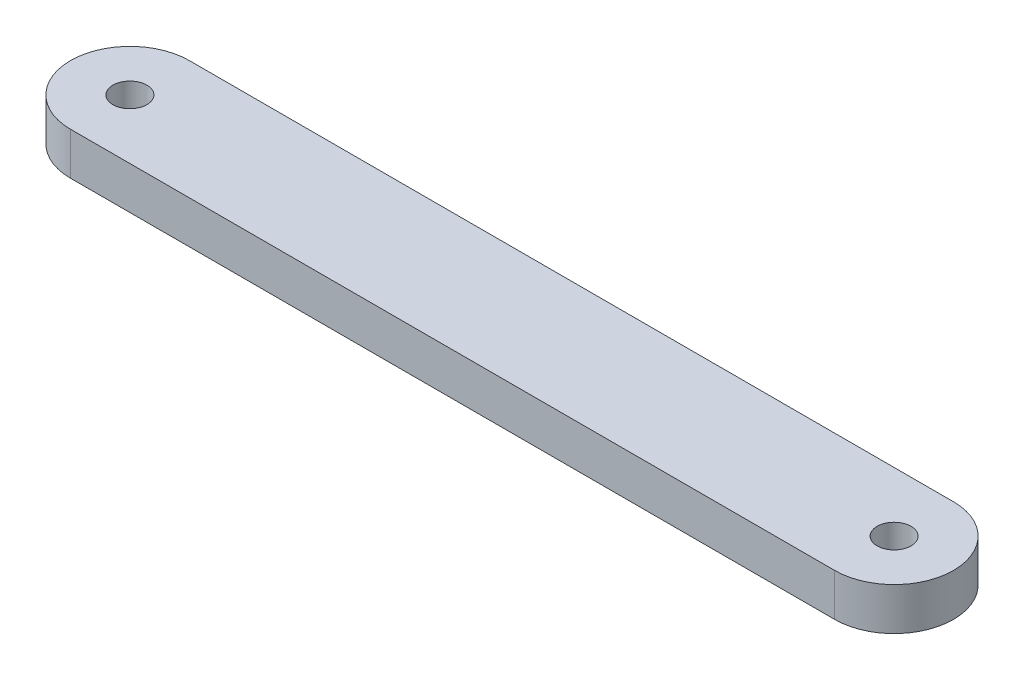
ISO-10303-21;
HEADER;
FILE_DESCRIPTION(('STEP AP214'),'2;1');
FILE_NAME('part.step','',(''),(''),'','','');
FILE_SCHEMA(('AUTOMOTIVE_DESIGN { 1 0 10303 214 1 1 1 1 }'));
ENDSEC;
DATA;
#1=APPLICATION_CONTEXT('core data for automotive mechanical design processes');
#2=APPLICATION_PROTOCOL_DEFINITION('international standard','automotive_design',2000,#1);
#3=PRODUCT_CONTEXT('',#1,'mechanical');
#4=PRODUCT('Part','Part','',(#3));
#5=PRODUCT_RELATED_PRODUCT_CATEGORY('part','',(#4));
#6=PRODUCT_DEFINITION_FORMATION('','',#4);
#7=PRODUCT_DEFINITION_CONTEXT('part definition',#1,'design');
#8=PRODUCT_DEFINITION('design','',#6,#7);
#9=PRODUCT_DEFINITION_SHAPE('','',#8);
#10=(LENGTH_UNIT() NAMED_UNIT(*) SI_UNIT(.MILLI.,.METRE.));
#11=(NAMED_UNIT(*) PLANE_ANGLE_UNIT() SI_UNIT($,.RADIAN.));
#12=(NAMED_UNIT(*) SI_UNIT($,.STERADIAN.) SOLID_ANGLE_UNIT());
#13=UNCERTAINTY_MEASURE_WITH_UNIT(LENGTH_MEASURE(1.E-05),#10,'distance_accuracy_value','');
#14=(GEOMETRIC_REPRESENTATION_CONTEXT(3) GLOBAL_UNCERTAINTY_ASSIGNED_CONTEXT((#13)) GLOBAL_UNIT_ASSIGNED_CONTEXT((#10,
#11,#12)) REPRESENTATION_CONTEXT('',''));
#15=CARTESIAN_POINT('',(0.,0.,0.));
#16=DIRECTION('',(0.,0.,1.));
#17=DIRECTION('',(1.,0.,0.));
#18=AXIS2_PLACEMENT_3D('',#15,#16,#17);
#19=CARTESIAN_POINT('',(-45.,2.5,0.));
#20=DIRECTION('',(0.,1.,0.));
#21=DIRECTION('',(0.,0.,1.));
#22=AXIS2_PLACEMENT_3D('',#19,#20,#21);
#23=PLANE('',#22);
#24=CARTESIAN_POINT('',(-45.,2.5,0.));
#25=DIRECTION('',(0.,1.,0.));
#26=DIRECTION('',(0.,0.,1.));
#27=AXIS2_PLACEMENT_3D('',#24,#25,#26);
#28=CIRCLE('',#27,2.);
#29=CARTESIAN_POINT('',(-45.,2.5,1.99999999999997));
#30=VERTEX_POINT('',#29);
#31=EDGE_CURVE('E104',#30,#30,#28,.T.);
#32=ORIENTED_EDGE('',*,*,#31,.F.);
#33=EDGE_LOOP('',(#32));
#34=FACE_BOUND('',#33,.T.);
#35=CARTESIAN_POINT('',(-45.,2.5,0.));
#36=DIRECTION('',(0.,1.,0.));
#37=DIRECTION('',(0.,0.,1.));
#38=AXIS2_PLACEMENT_3D('',#35,#36,#37);
#39=CIRCLE('',#38,7.00000000000002);
#40=CARTESIAN_POINT('',(-45.,2.5,-7.00000000000002));
#41=VERTEX_POINT('',#40);
#42=CARTESIAN_POINT('',(-45.,2.5,7.00000000000002));
#43=VERTEX_POINT('',#42);
#44=EDGE_CURVE('E89',#41,#43,#39,.T.);
#45=ORIENTED_EDGE('',*,*,#44,.T.);
#46=DIRECTION('',(1.,0.,0.));
#47=VECTOR('',#46,1.);
#48=CARTESIAN_POINT('',(-45.,2.5,7.00000000000002));
#49=LINE('',#48,#47);
#50=CARTESIAN_POINT('',(45.,2.5,6.99999999999999));
#51=VERTEX_POINT('',#50);
#52=EDGE_CURVE('E84',#43,#51,#49,.T.);
#53=ORIENTED_EDGE('',*,*,#52,.T.);
#54=CARTESIAN_POINT('',(45.,2.5,0.));
#55=DIRECTION('',(0.,1.,0.));
#56=DIRECTION('',(0.,0.,1.));
#57=AXIS2_PLACEMENT_3D('',#54,#55,#56);
#58=CIRCLE('',#57,7.00000000000002);
#59=CARTESIAN_POINT('',(45.,2.5,-7.00000000000002));
#60=VERTEX_POINT('',#59);
#61=EDGE_CURVE('E87',#51,#60,#58,.T.);
#62=ORIENTED_EDGE('',*,*,#61,.T.);
#63=DIRECTION('',(-1.,0.,0.));
#64=VECTOR('',#63,1.);
#65=CARTESIAN_POINT('',(-45.,2.5,-7.00000000000002));
#66=LINE('',#65,#64);
#67=EDGE_CURVE('E54',#60,#41,#66,.T.);
#68=ORIENTED_EDGE('',*,*,#67,.T.);
#69=EDGE_LOOP('',(#45,#53,#62,#68));
#70=FACE_BOUND('',#69,.T.);
#71=CARTESIAN_POINT('',(45.,2.5,0.));
#72=DIRECTION('',(0.,1.,0.));
#73=DIRECTION('',(0.,0.,1.));
#74=AXIS2_PLACEMENT_3D('',#71,#72,#73);
#75=CIRCLE('',#74,2.);
#76=CARTESIAN_POINT('',(45.,2.5,1.99999999999997));
#77=VERTEX_POINT('',#76);
#78=EDGE_CURVE('E119',#77,#77,#75,.T.);
#79=ORIENTED_EDGE('',*,*,#78,.F.);
#80=EDGE_LOOP('',(#79));
#81=FACE_BOUND('',#80,.T.);
#82=ADVANCED_FACE('F37',(#34,#70,#81),#23,.T.);
#83=CARTESIAN_POINT('',(-45.,-2.5,0.));
#84=DIRECTION('',(0.,1.,0.));
#85=DIRECTION('',(0.,0.,1.));
#86=AXIS2_PLACEMENT_3D('',#83,#84,#85);
#87=PLANE('',#86);
#88=CARTESIAN_POINT('',(0.,-2.5,0.));
#89=DIRECTION('',(0.,-1.,0.));
#90=DIRECTION('',(0.,0.,-1.));
#91=AXIS2_PLACEMENT_3D('',#88,#89,#90);
#92=CIRCLE('',#91,2.);
#93=CARTESIAN_POINT('',(0.,-2.5,-2.));
#94=VERTEX_POINT('',#93);
#95=EDGE_CURVE('E130',#94,#94,#92,.T.);
#96=ORIENTED_EDGE('',*,*,#95,.F.);
#97=EDGE_LOOP('',(#96));
#98=FACE_BOUND('',#97,.T.);
#99=CARTESIAN_POINT('',(-45.,-2.5,0.));
#100=DIRECTION('',(0.,1.,0.));
#101=DIRECTION('',(0.,0.,1.));
#102=AXIS2_PLACEMENT_3D('',#99,#100,#101);
#103=CIRCLE('',#102,7.00000000000002);
#104=CARTESIAN_POINT('',(-45.,-2.5,-7.00000000000002));
#105=VERTEX_POINT('',#104);
#106=CARTESIAN_POINT('',(-45.,-2.5,7.00000000000002));
#107=VERTEX_POINT('',#106);
#108=EDGE_CURVE('E101',#105,#107,#103,.T.);
#109=ORIENTED_EDGE('',*,*,#108,.F.);
#110=DIRECTION('',(-1.,0.,0.));
#111=VECTOR('',#110,1.);
#112=CARTESIAN_POINT('',(-45.,-2.5,-7.00000000000002));
#113=LINE('',#112,#111);
#114=CARTESIAN_POINT('',(45.,-2.5,-7.00000000000002));
#115=VERTEX_POINT('',#114);
#116=EDGE_CURVE('E77',#115,#105,#113,.T.);
#117=ORIENTED_EDGE('',*,*,#116,.F.);
#118=CARTESIAN_POINT('',(45.,-2.5,0.));
#119=DIRECTION('',(0.,1.,0.));
#120=DIRECTION('',(0.,0.,1.));
#121=AXIS2_PLACEMENT_3D('',#118,#119,#120);
#122=CIRCLE('',#121,7.00000000000002);
#123=CARTESIAN_POINT('',(45.,-2.5,6.99999999999999));
#124=VERTEX_POINT('',#123);
#125=EDGE_CURVE('E71',#124,#115,#122,.T.);
#126=ORIENTED_EDGE('',*,*,#125,.F.);
#127=DIRECTION('',(1.,0.,0.));
#128=VECTOR('',#127,1.);
#129=CARTESIAN_POINT('',(-45.,-2.5,7.00000000000002));
#130=LINE('',#129,#128);
#131=EDGE_CURVE('E93',#107,#124,#130,.T.);
#132=ORIENTED_EDGE('',*,*,#131,.F.);
#133=EDGE_LOOP('',(#109,#117,#126,#132));
#134=FACE_BOUND('',#133,.T.);
#135=CARTESIAN_POINT('',(-45.,-2.5,0.));
#136=DIRECTION('',(0.,1.,0.));
#137=DIRECTION('',(0.,0.,1.));
#138=AXIS2_PLACEMENT_3D('',#135,#136,#137);
#139=CIRCLE('',#138,2.);
#140=CARTESIAN_POINT('',(-45.,-2.5,1.99999999999997));
#141=VERTEX_POINT('',#140);
#142=EDGE_CURVE('E116',#141,#141,#139,.T.);
#143=ORIENTED_EDGE('',*,*,#142,.T.);
#144=EDGE_LOOP('',(#143));
#145=FACE_BOUND('',#144,.T.);
#146=CARTESIAN_POINT('',(45.,-2.5,0.));
#147=DIRECTION('',(0.,1.,0.));
#148=DIRECTION('',(0.,0.,1.));
#149=AXIS2_PLACEMENT_3D('',#146,#147,#148);
#150=CIRCLE('',#149,2.);
#151=CARTESIAN_POINT('',(45.,-2.5,1.99999999999997));
#152=VERTEX_POINT('',#151);
#153=EDGE_CURVE('E122',#152,#152,#150,.T.);
#154=ORIENTED_EDGE('',*,*,#153,.T.);
#155=EDGE_LOOP('',(#154));
#156=FACE_BOUND('',#155,.T.);
#157=ADVANCED_FACE('F112',(#98,#134,#145,#156),#87,.F.);
#158=CARTESIAN_POINT('',(-45.,2.5,0.));
#159=DIRECTION('',(0.,-1.,0.));
#160=DIRECTION('',(0.,0.,-1.));
#161=AXIS2_PLACEMENT_3D('',#158,#159,#160);
#162=CYLINDRICAL_SURFACE('',#161,7.00000000000002);
#163=ORIENTED_EDGE('',*,*,#108,.T.);
#164=DIRECTION('',(0.,-1.,0.));
#165=VECTOR('',#164,1.);
#166=CARTESIAN_POINT('',(-45.,2.5,7.00000000000002));
#167=LINE('',#166,#165);
#168=EDGE_CURVE('E11',#43,#107,#167,.T.);
#169=ORIENTED_EDGE('',*,*,#168,.F.);
#170=ORIENTED_EDGE('',*,*,#44,.F.);
#171=DIRECTION('',(0.,-1.,0.));
#172=VECTOR('',#171,1.);
#173=CARTESIAN_POINT('',(-45.,2.5,-7.00000000000002));
#174=LINE('',#173,#172);
#175=EDGE_CURVE('E97',#41,#105,#174,.T.);
#176=ORIENTED_EDGE('',*,*,#175,.T.);
#177=EDGE_LOOP('',(#163,#169,#170,#176));
#178=FACE_BOUND('',#177,.T.);
#179=ADVANCED_FACE('F39',(#178),#162,.T.);
#180=CARTESIAN_POINT('',(-45.,2.5,7.00000000000002));
#181=DIRECTION('',(0.,0.,-1.));
#182=DIRECTION('',(-1.,0.,0.));
#183=AXIS2_PLACEMENT_3D('',#180,#181,#182);
#184=PLANE('',#183);
#185=ORIENTED_EDGE('',*,*,#131,.T.);
#186=DIRECTION('',(0.,-1.,0.));
#187=VECTOR('',#186,1.);
#188=CARTESIAN_POINT('',(45.,2.5,6.99999999999999));
#189=LINE('',#188,#187);
#190=EDGE_CURVE('E46',#51,#124,#189,.T.);
#191=ORIENTED_EDGE('',*,*,#190,.F.);
#192=ORIENTED_EDGE('',*,*,#52,.F.);
#193=ORIENTED_EDGE('',*,*,#168,.T.);
#194=EDGE_LOOP('',(#185,#191,#192,#193));
#195=FACE_BOUND('',#194,.T.);
#196=ADVANCED_FACE('F92',(#195),#184,.F.);
#197=CARTESIAN_POINT('',(45.,2.5,0.));
#198=DIRECTION('',(0.,-1.,0.));
#199=DIRECTION('',(0.,0.,-1.));
#200=AXIS2_PLACEMENT_3D('',#197,#198,#199);
#201=CYLINDRICAL_SURFACE('',#200,7.00000000000002);
#202=ORIENTED_EDGE('',*,*,#125,.T.);
#203=DIRECTION('',(0.,-1.,0.));
#204=VECTOR('',#203,1.);
#205=CARTESIAN_POINT('',(45.,2.5,-7.00000000000002));
#206=LINE('',#205,#204);
#207=EDGE_CURVE('E94',#60,#115,#206,.T.);
#208=ORIENTED_EDGE('',*,*,#207,.F.);
#209=ORIENTED_EDGE('',*,*,#61,.F.);
#210=ORIENTED_EDGE('',*,*,#190,.T.);
#211=EDGE_LOOP('',(#202,#208,#209,#210));
#212=FACE_BOUND('',#211,.T.);
#213=ADVANCED_FACE('F95',(#212),#201,.T.);
#214=CARTESIAN_POINT('',(-45.,2.5,-7.00000000000002));
#215=DIRECTION('',(0.,0.,1.));
#216=DIRECTION('',(1.,0.,0.));
#217=AXIS2_PLACEMENT_3D('',#214,#215,#216);
#218=PLANE('',#217);
#219=ORIENTED_EDGE('',*,*,#116,.T.);
#220=ORIENTED_EDGE('',*,*,#175,.F.);
#221=ORIENTED_EDGE('',*,*,#67,.F.);
#222=ORIENTED_EDGE('',*,*,#207,.T.);
#223=EDGE_LOOP('',(#219,#220,#221,#222));
#224=FACE_BOUND('',#223,.T.);
#225=ADVANCED_FACE('F109',(#224),#218,.F.);
#226=CARTESIAN_POINT('',(-45.,2.5,0.));
#227=DIRECTION('',(0.,-1.,0.));
#228=DIRECTION('',(0.,0.,-1.));
#229=AXIS2_PLACEMENT_3D('',#226,#227,#228);
#230=CYLINDRICAL_SURFACE('',#229,2.);
#231=ORIENTED_EDGE('',*,*,#31,.T.);
#232=EDGE_LOOP('',(#231));
#233=FACE_BOUND('',#232,.T.);
#234=ORIENTED_EDGE('',*,*,#142,.F.);
#235=EDGE_LOOP('',(#234));
#236=FACE_BOUND('',#235,.T.);
#237=ADVANCED_FACE('F149',(#233,#236),#230,.F.);
#238=CARTESIAN_POINT('',(45.,2.5,0.));
#239=DIRECTION('',(0.,-1.,0.));
#240=DIRECTION('',(0.,0.,-1.));
#241=AXIS2_PLACEMENT_3D('',#238,#239,#240);
#242=CYLINDRICAL_SURFACE('',#241,2.);
#243=ORIENTED_EDGE('',*,*,#78,.T.);
#244=EDGE_LOOP('',(#243));
#245=FACE_BOUND('',#244,.T.);
#246=ORIENTED_EDGE('',*,*,#153,.F.);
#247=EDGE_LOOP('',(#246));
#248=FACE_BOUND('',#247,.T.);
#249=ADVANCED_FACE('F170',(#245,#248),#242,.F.);
#250=CARTESIAN_POINT('',(0.,0.,0.));
#251=DIRECTION('',(0.,1.,0.));
#252=DIRECTION('',(0.,0.,1.));
#253=AXIS2_PLACEMENT_3D('',#250,#251,#252);
#254=PLANE('',#253);
#255=CARTESIAN_POINT('',(0.,0.,0.));
#256=DIRECTION('',(0.,1.,0.));
#257=DIRECTION('',(0.,0.,1.));
#258=AXIS2_PLACEMENT_3D('',#255,#256,#257);
#259=CIRCLE('',#258,2.);
#260=CARTESIAN_POINT('',(0.,0.,2.));
#261=VERTEX_POINT('',#260);
#262=EDGE_CURVE('E125',#261,#261,#259,.F.);
#263=ORIENTED_EDGE('',*,*,#262,.T.);
#264=EDGE_LOOP('',(#263));
#265=FACE_BOUND('',#264,.T.);
#266=ADVANCED_FACE('F177',(#265),#254,.F.);
#267=CARTESIAN_POINT('',(0.,5.65685424949238,0.));
#268=DIRECTION('',(0.,-1.,0.));
#269=DIRECTION('',(0.,0.,-1.));
#270=AXIS2_PLACEMENT_3D('',#267,#268,#269);
#271=CYLINDRICAL_SURFACE('',#270,2.);
#272=ORIENTED_EDGE('',*,*,#95,.T.);
#273=EDGE_LOOP('',(#272));
#274=FACE_BOUND('',#273,.T.);
#275=ORIENTED_EDGE('',*,*,#262,.F.);
#276=EDGE_LOOP('',(#275));
#277=FACE_BOUND('',#276,.T.);
#278=ADVANCED_FACE('F134',(#274,#277),#271,.F.);
#279=CLOSED_SHELL('',(#82,#157,#179,#196,#213,#225,#237,#249,#266,#278));
#280=MANIFOLD_SOLID_BREP('B2',#279);
#281=ADVANCED_BREP_SHAPE_REPRESENTATION('',(#18,#280),#14);
#282=SHAPE_DEFINITION_REPRESENTATION(#9,#281);
ENDSEC;
END-ISO-10303-21;
